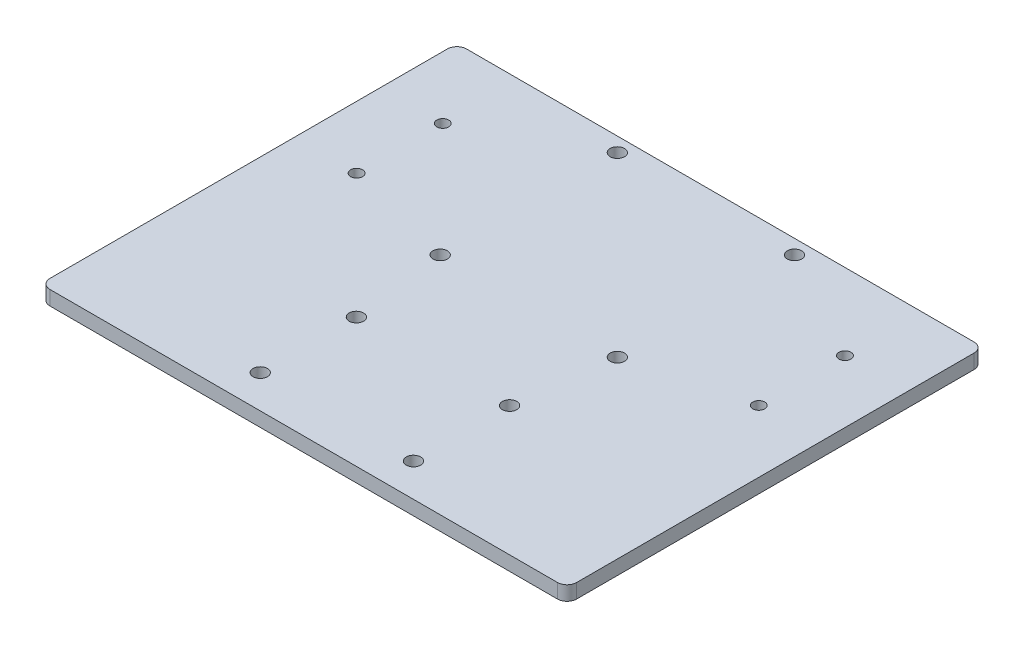
ISO-10303-21;
HEADER;
FILE_DESCRIPTION(('STEP AP214'),'2;1');
FILE_NAME('part.step','',(''),(''),'','','');
FILE_SCHEMA(('AUTOMOTIVE_DESIGN { 1 0 10303 214 1 1 1 1 }'));
ENDSEC;
DATA;
#1=APPLICATION_CONTEXT('core data for automotive mechanical design processes');
#2=APPLICATION_PROTOCOL_DEFINITION('international standard','automotive_design',2000,#1);
#3=PRODUCT_CONTEXT('',#1,'mechanical');
#4=PRODUCT('Part','Part','',(#3));
#5=PRODUCT_RELATED_PRODUCT_CATEGORY('part','',(#4));
#6=PRODUCT_DEFINITION_FORMATION('','',#4);
#7=PRODUCT_DEFINITION_CONTEXT('part definition',#1,'design');
#8=PRODUCT_DEFINITION('design','',#6,#7);
#9=PRODUCT_DEFINITION_SHAPE('','',#8);
#10=(LENGTH_UNIT() NAMED_UNIT(*) SI_UNIT(.MILLI.,.METRE.));
#11=(NAMED_UNIT(*) PLANE_ANGLE_UNIT() SI_UNIT($,.RADIAN.));
#12=(NAMED_UNIT(*) SI_UNIT($,.STERADIAN.) SOLID_ANGLE_UNIT());
#13=UNCERTAINTY_MEASURE_WITH_UNIT(LENGTH_MEASURE(1.E-05),#10,'distance_accuracy_value','');
#14=(GEOMETRIC_REPRESENTATION_CONTEXT(3) GLOBAL_UNCERTAINTY_ASSIGNED_CONTEXT((#13)) GLOBAL_UNIT_ASSIGNED_CONTEXT((#10,
#11,#12)) REPRESENTATION_CONTEXT('',''));
#15=CARTESIAN_POINT('',(0.,0.,0.));
#16=DIRECTION('',(0.,0.,1.));
#17=DIRECTION('',(1.,0.,0.));
#18=AXIS2_PLACEMENT_3D('',#15,#16,#17);
#19=CARTESIAN_POINT('',(55.,3.,43.5));
#20=DIRECTION('',(-1.,0.,0.));
#21=DIRECTION('',(0.,0.,1.));
#22=AXIS2_PLACEMENT_3D('',#19,#20,#21);
#23=PLANE('',#22);
#24=DIRECTION('',(0.,0.,-1.));
#25=VECTOR('',#24,1.);
#26=CARTESIAN_POINT('',(55.,0.,43.5));
#27=LINE('',#26,#25);
#28=CARTESIAN_POINT('',(55.,0.,41.5));
#29=VERTEX_POINT('',#28);
#30=CARTESIAN_POINT('',(55.,0.,-41.5));
#31=VERTEX_POINT('',#30);
#32=EDGE_CURVE('E131',#29,#31,#27,.T.);
#33=ORIENTED_EDGE('',*,*,#32,.T.);
#34=DIRECTION('',(0.,-1.,0.));
#35=VECTOR('',#34,1.);
#36=CARTESIAN_POINT('',(55.,3.,-41.5));
#37=LINE('',#36,#35);
#38=CARTESIAN_POINT('',(55.,3.,-41.5));
#39=VERTEX_POINT('',#38);
#40=EDGE_CURVE('E154',#31,#39,#37,.F.);
#41=ORIENTED_EDGE('',*,*,#40,.T.);
#42=DIRECTION('',(0.,0.,-1.));
#43=VECTOR('',#42,1.);
#44=CARTESIAN_POINT('',(55.,3.,43.5));
#45=LINE('',#44,#43);
#46=CARTESIAN_POINT('',(55.,3.,41.5));
#47=VERTEX_POINT('',#46);
#48=EDGE_CURVE('E129',#47,#39,#45,.T.);
#49=ORIENTED_EDGE('',*,*,#48,.F.);
#50=DIRECTION('',(0.,-1.,0.));
#51=VECTOR('',#50,1.);
#52=CARTESIAN_POINT('',(55.,3.,41.5));
#53=LINE('',#52,#51);
#54=EDGE_CURVE('E151',#47,#29,#53,.T.);
#55=ORIENTED_EDGE('',*,*,#54,.T.);
#56=EDGE_LOOP('',(#33,#41,#49,#55));
#57=FACE_BOUND('',#56,.T.);
#58=ADVANCED_FACE('F34',(#57),#23,.F.);
#59=CARTESIAN_POINT('',(-55.,3.,-43.5));
#60=DIRECTION('',(0.,0.,1.));
#61=DIRECTION('',(1.,0.,0.));
#62=AXIS2_PLACEMENT_3D('',#59,#60,#61);
#63=PLANE('',#62);
#64=DIRECTION('',(-1.,0.,0.));
#65=VECTOR('',#64,1.);
#66=CARTESIAN_POINT('',(-55.,0.,-43.5));
#67=LINE('',#66,#65);
#68=CARTESIAN_POINT('',(53.,0.,-43.5));
#69=VERTEX_POINT('',#68);
#70=CARTESIAN_POINT('',(-53.,0.,-43.5));
#71=VERTEX_POINT('',#70);
#72=EDGE_CURVE('E127',#69,#71,#67,.T.);
#73=ORIENTED_EDGE('',*,*,#72,.T.);
#74=DIRECTION('',(0.,-1.,0.));
#75=VECTOR('',#74,1.);
#76=CARTESIAN_POINT('',(-53.,3.,-43.5));
#77=LINE('',#76,#75);
#78=CARTESIAN_POINT('',(-53.,3.,-43.5));
#79=VERTEX_POINT('',#78);
#80=EDGE_CURVE('E106',#71,#79,#77,.F.);
#81=ORIENTED_EDGE('',*,*,#80,.T.);
#82=DIRECTION('',(-1.,0.,0.));
#83=VECTOR('',#82,1.);
#84=CARTESIAN_POINT('',(-55.,3.,-43.5));
#85=LINE('',#84,#83);
#86=CARTESIAN_POINT('',(53.,3.,-43.5));
#87=VERTEX_POINT('',#86);
#88=EDGE_CURVE('E202',#87,#79,#85,.T.);
#89=ORIENTED_EDGE('',*,*,#88,.F.);
#90=DIRECTION('',(0.,-1.,0.));
#91=VECTOR('',#90,1.);
#92=CARTESIAN_POINT('',(53.,3.,-43.5));
#93=LINE('',#92,#91);
#94=EDGE_CURVE('E111',#87,#69,#93,.T.);
#95=ORIENTED_EDGE('',*,*,#94,.T.);
#96=EDGE_LOOP('',(#73,#81,#89,#95));
#97=FACE_BOUND('',#96,.T.);
#98=ADVANCED_FACE('F260',(#97),#63,.F.);
#99=CARTESIAN_POINT('',(-55.,3.,43.5));
#100=DIRECTION('',(1.,0.,0.));
#101=DIRECTION('',(0.,0.,-1.));
#102=AXIS2_PLACEMENT_3D('',#99,#100,#101);
#103=PLANE('',#102);
#104=DIRECTION('',(0.,0.,1.));
#105=VECTOR('',#104,1.);
#106=CARTESIAN_POINT('',(-55.,3.,43.5));
#107=LINE('',#106,#105);
#108=CARTESIAN_POINT('',(-55.,3.,-41.5));
#109=VERTEX_POINT('',#108);
#110=CARTESIAN_POINT('',(-55.,3.,41.5));
#111=VERTEX_POINT('',#110);
#112=EDGE_CURVE('E120',#109,#111,#107,.T.);
#113=ORIENTED_EDGE('',*,*,#112,.F.);
#114=DIRECTION('',(0.,-1.,0.));
#115=VECTOR('',#114,1.);
#116=CARTESIAN_POINT('',(-55.,3.,-41.5));
#117=LINE('',#116,#115);
#118=CARTESIAN_POINT('',(-55.,0.,-41.5));
#119=VERTEX_POINT('',#118);
#120=EDGE_CURVE('E105',#109,#119,#117,.T.);
#121=ORIENTED_EDGE('',*,*,#120,.T.);
#122=DIRECTION('',(0.,0.,1.));
#123=VECTOR('',#122,1.);
#124=CARTESIAN_POINT('',(-55.,0.,43.5));
#125=LINE('',#124,#123);
#126=CARTESIAN_POINT('',(-55.,0.,41.5));
#127=VERTEX_POINT('',#126);
#128=EDGE_CURVE('E118',#119,#127,#125,.T.);
#129=ORIENTED_EDGE('',*,*,#128,.T.);
#130=DIRECTION('',(0.,-1.,0.));
#131=VECTOR('',#130,1.);
#132=CARTESIAN_POINT('',(-55.,3.,41.5));
#133=LINE('',#132,#131);
#134=EDGE_CURVE('E122',#127,#111,#133,.F.);
#135=ORIENTED_EDGE('',*,*,#134,.T.);
#136=EDGE_LOOP('',(#113,#121,#129,#135));
#137=FACE_BOUND('',#136,.T.);
#138=ADVANCED_FACE('F117',(#137),#103,.F.);
#139=CARTESIAN_POINT('',(-55.,3.,43.5));
#140=DIRECTION('',(0.,0.,-1.));
#141=DIRECTION('',(-1.,0.,0.));
#142=AXIS2_PLACEMENT_3D('',#139,#140,#141);
#143=PLANE('',#142);
#144=DIRECTION('',(1.,0.,0.));
#145=VECTOR('',#144,1.);
#146=CARTESIAN_POINT('',(-55.,0.,43.5));
#147=LINE('',#146,#145);
#148=CARTESIAN_POINT('',(-53.,0.,43.5));
#149=VERTEX_POINT('',#148);
#150=CARTESIAN_POINT('',(53.,0.,43.5));
#151=VERTEX_POINT('',#150);
#152=EDGE_CURVE('E126',#149,#151,#147,.T.);
#153=ORIENTED_EDGE('',*,*,#152,.T.);
#154=DIRECTION('',(0.,-1.,0.));
#155=VECTOR('',#154,1.);
#156=CARTESIAN_POINT('',(53.,3.,43.5));
#157=LINE('',#156,#155);
#158=CARTESIAN_POINT('',(53.,3.,43.5));
#159=VERTEX_POINT('',#158);
#160=EDGE_CURVE('E11',#151,#159,#157,.F.);
#161=ORIENTED_EDGE('',*,*,#160,.T.);
#162=DIRECTION('',(1.,0.,0.));
#163=VECTOR('',#162,1.);
#164=CARTESIAN_POINT('',(-55.,3.,43.5));
#165=LINE('',#164,#163);
#166=CARTESIAN_POINT('',(-53.,3.,43.5));
#167=VERTEX_POINT('',#166);
#168=EDGE_CURVE('E135',#167,#159,#165,.T.);
#169=ORIENTED_EDGE('',*,*,#168,.F.);
#170=DIRECTION('',(0.,-1.,0.));
#171=VECTOR('',#170,1.);
#172=CARTESIAN_POINT('',(-53.,3.,43.5));
#173=LINE('',#172,#171);
#174=EDGE_CURVE('E43',#167,#149,#173,.T.);
#175=ORIENTED_EDGE('',*,*,#174,.T.);
#176=EDGE_LOOP('',(#153,#161,#169,#175));
#177=FACE_BOUND('',#176,.T.);
#178=ADVANCED_FACE('F248',(#177),#143,.F.);
#179=CARTESIAN_POINT('',(0.,3.,0.));
#180=DIRECTION('',(0.,-1.,0.));
#181=DIRECTION('',(0.,0.,-1.));
#182=AXIS2_PLACEMENT_3D('',#179,#180,#181);
#183=PLANE('',#182);
#184=CARTESIAN_POINT('',(-42.,3.,-9.53999999999998));
#185=DIRECTION('',(0.,1.,0.));
#186=DIRECTION('',(0.,0.,1.));
#187=AXIS2_PLACEMENT_3D('',#184,#185,#186);
#188=CIRCLE('',#187,1.25);
#189=CARTESIAN_POINT('',(-42.,3.,-8.28999999999998));
#190=VERTEX_POINT('',#189);
#191=EDGE_CURVE('E214',#190,#190,#188,.T.);
#192=ORIENTED_EDGE('',*,*,#191,.F.);
#193=EDGE_LOOP('',(#192));
#194=FACE_BOUND('',#193,.T.);
#195=CARTESIAN_POINT('',(42.,3.,-27.54));
#196=DIRECTION('',(0.,1.,0.));
#197=DIRECTION('',(0.,0.,1.));
#198=AXIS2_PLACEMENT_3D('',#195,#196,#197);
#199=CIRCLE('',#198,1.25);
#200=CARTESIAN_POINT('',(42.,3.,-26.29));
#201=VERTEX_POINT('',#200);
#202=EDGE_CURVE('E222',#201,#201,#199,.T.);
#203=ORIENTED_EDGE('',*,*,#202,.F.);
#204=EDGE_LOOP('',(#203));
#205=FACE_BOUND('',#204,.T.);
#206=CARTESIAN_POINT('',(42.,3.,-9.53999999999998));
#207=DIRECTION('',(0.,1.,0.));
#208=DIRECTION('',(0.,0.,1.));
#209=AXIS2_PLACEMENT_3D('',#206,#207,#208);
#210=CIRCLE('',#209,1.25000000000001);
#211=CARTESIAN_POINT('',(42.,3.,-8.28999999999998));
#212=VERTEX_POINT('',#211);
#213=EDGE_CURVE('E225',#212,#212,#210,.T.);
#214=ORIENTED_EDGE('',*,*,#213,.F.);
#215=EDGE_LOOP('',(#214));
#216=FACE_BOUND('',#215,.T.);
#217=CARTESIAN_POINT('',(-16.,3.,36.58));
#218=DIRECTION('',(0.,1.,0.));
#219=DIRECTION('',(0.,0.,1.));
#220=AXIS2_PLACEMENT_3D('',#217,#218,#219);
#221=CIRCLE('',#220,1.5);
#222=CARTESIAN_POINT('',(-16.,3.,38.08));
#223=VERTEX_POINT('',#222);
#224=EDGE_CURVE('E228',#223,#223,#221,.T.);
#225=ORIENTED_EDGE('',*,*,#224,.F.);
#226=EDGE_LOOP('',(#225));
#227=FACE_BOUND('',#226,.T.);
#228=CARTESIAN_POINT('',(-42.,3.,-27.54));
#229=DIRECTION('',(0.,1.,0.));
#230=DIRECTION('',(0.,0.,1.));
#231=AXIS2_PLACEMENT_3D('',#228,#229,#230);
#232=CIRCLE('',#231,1.25);
#233=CARTESIAN_POINT('',(-42.,3.,-26.29));
#234=VERTEX_POINT('',#233);
#235=EDGE_CURVE('E210',#234,#234,#232,.T.);
#236=ORIENTED_EDGE('',*,*,#235,.F.);
#237=EDGE_LOOP('',(#236));
#238=FACE_BOUND('',#237,.T.);
#239=CARTESIAN_POINT('',(-18.5,3.,-3.49999999999998));
#240=DIRECTION('',(0.,1.,0.));
#241=DIRECTION('',(0.,0.,1.));
#242=AXIS2_PLACEMENT_3D('',#239,#240,#241);
#243=CIRCLE('',#242,1.5);
#244=CARTESIAN_POINT('',(-18.5,3.,-1.99999999999998));
#245=VERTEX_POINT('',#244);
#246=EDGE_CURVE('E213',#245,#245,#243,.T.);
#247=ORIENTED_EDGE('',*,*,#246,.F.);
#248=EDGE_LOOP('',(#247));
#249=FACE_BOUND('',#248,.T.);
#250=CARTESIAN_POINT('',(18.5,3.,-3.49999999999998));
#251=DIRECTION('',(0.,1.,0.));
#252=DIRECTION('',(0.,0.,1.));
#253=AXIS2_PLACEMENT_3D('',#250,#251,#252);
#254=CIRCLE('',#253,1.5);
#255=CARTESIAN_POINT('',(18.5,3.,-1.99999999999998));
#256=VERTEX_POINT('',#255);
#257=EDGE_CURVE('E217',#256,#256,#254,.T.);
#258=ORIENTED_EDGE('',*,*,#257,.F.);
#259=EDGE_LOOP('',(#258));
#260=FACE_BOUND('',#259,.T.);
#261=CARTESIAN_POINT('',(18.5,3.,-40.5));
#262=DIRECTION('',(0.,1.,0.));
#263=DIRECTION('',(0.,0.,1.));
#264=AXIS2_PLACEMENT_3D('',#261,#262,#263);
#265=CIRCLE('',#264,1.5);
#266=CARTESIAN_POINT('',(18.5,3.,-39.));
#267=VERTEX_POINT('',#266);
#268=EDGE_CURVE('E209',#267,#267,#265,.T.);
#269=ORIENTED_EDGE('',*,*,#268,.F.);
#270=EDGE_LOOP('',(#269));
#271=FACE_BOUND('',#270,.T.);
#272=CARTESIAN_POINT('',(-16.,3.,16.5));
#273=DIRECTION('',(0.,1.,0.));
#274=DIRECTION('',(0.,0.,1.));
#275=AXIS2_PLACEMENT_3D('',#272,#273,#274);
#276=CIRCLE('',#275,1.5);
#277=CARTESIAN_POINT('',(-16.,3.,18.));
#278=VERTEX_POINT('',#277);
#279=EDGE_CURVE('E231',#278,#278,#276,.T.);
#280=ORIENTED_EDGE('',*,*,#279,.F.);
#281=EDGE_LOOP('',(#280));
#282=FACE_BOUND('',#281,.T.);
#283=CARTESIAN_POINT('',(16.,3.,16.5));
#284=DIRECTION('',(0.,1.,0.));
#285=DIRECTION('',(0.,0.,1.));
#286=AXIS2_PLACEMENT_3D('',#283,#284,#285);
#287=CIRCLE('',#286,1.5);
#288=CARTESIAN_POINT('',(16.,3.,18.));
#289=VERTEX_POINT('',#288);
#290=EDGE_CURVE('E237',#289,#289,#287,.T.);
#291=ORIENTED_EDGE('',*,*,#290,.F.);
#292=EDGE_LOOP('',(#291));
#293=FACE_BOUND('',#292,.T.);
#294=CARTESIAN_POINT('',(16.,3.,36.58));
#295=DIRECTION('',(0.,1.,0.));
#296=DIRECTION('',(0.,0.,1.));
#297=AXIS2_PLACEMENT_3D('',#294,#295,#296);
#298=CIRCLE('',#297,1.5);
#299=CARTESIAN_POINT('',(16.,3.,38.08));
#300=VERTEX_POINT('',#299);
#301=EDGE_CURVE('E234',#300,#300,#298,.T.);
#302=ORIENTED_EDGE('',*,*,#301,.F.);
#303=EDGE_LOOP('',(#302));
#304=FACE_BOUND('',#303,.T.);
#305=CARTESIAN_POINT('',(-18.5,3.,-40.5));
#306=DIRECTION('',(0.,1.,0.));
#307=DIRECTION('',(0.,0.,1.));
#308=AXIS2_PLACEMENT_3D('',#305,#306,#307);
#309=CIRCLE('',#308,1.5);
#310=CARTESIAN_POINT('',(-18.5,3.,-39.));
#311=VERTEX_POINT('',#310);
#312=EDGE_CURVE('E162',#311,#311,#309,.T.);
#313=ORIENTED_EDGE('',*,*,#312,.F.);
#314=EDGE_LOOP('',(#313));
#315=FACE_BOUND('',#314,.T.);
#316=ORIENTED_EDGE('',*,*,#88,.T.);
#317=CARTESIAN_POINT('',(-53.,3.,-41.5));
#318=DIRECTION('',(0.,-1.,0.));
#319=DIRECTION('',(0.,0.,-1.));
#320=AXIS2_PLACEMENT_3D('',#317,#318,#319);
#321=CIRCLE('',#320,2.);
#322=EDGE_CURVE('E149',#79,#109,#321,.F.);
#323=ORIENTED_EDGE('',*,*,#322,.T.);
#324=ORIENTED_EDGE('',*,*,#112,.T.);
#325=CARTESIAN_POINT('',(-53.,3.,41.5));
#326=DIRECTION('',(0.,-1.,0.));
#327=DIRECTION('',(0.,0.,-1.));
#328=AXIS2_PLACEMENT_3D('',#325,#326,#327);
#329=CIRCLE('',#328,2.);
#330=EDGE_CURVE('E56',#111,#167,#329,.F.);
#331=ORIENTED_EDGE('',*,*,#330,.T.);
#332=ORIENTED_EDGE('',*,*,#168,.T.);
#333=CARTESIAN_POINT('',(53.,3.,41.5));
#334=DIRECTION('',(0.,-1.,0.));
#335=DIRECTION('',(0.,0.,-1.));
#336=AXIS2_PLACEMENT_3D('',#333,#334,#335);
#337=CIRCLE('',#336,2.);
#338=EDGE_CURVE('E145',#159,#47,#337,.F.);
#339=ORIENTED_EDGE('',*,*,#338,.T.);
#340=ORIENTED_EDGE('',*,*,#48,.T.);
#341=CARTESIAN_POINT('',(53.,3.,-41.5));
#342=DIRECTION('',(0.,-1.,0.));
#343=DIRECTION('',(0.,0.,-1.));
#344=AXIS2_PLACEMENT_3D('',#341,#342,#343);
#345=CIRCLE('',#344,2.);
#346=EDGE_CURVE('E147',#39,#87,#345,.F.);
#347=ORIENTED_EDGE('',*,*,#346,.T.);
#348=EDGE_LOOP('',(#316,#323,#324,#331,#332,#339,#340,#347));
#349=FACE_BOUND('',#348,.T.);
#350=ADVANCED_FACE('F245',(#194,#205,#216,#227,#238,#249,#260,#271,#282,#293,#304,#315,#349),
#183,.F.);
#351=CARTESIAN_POINT('',(0.,0.,0.));
#352=DIRECTION('',(0.,-1.,0.));
#353=DIRECTION('',(0.,0.,-1.));
#354=AXIS2_PLACEMENT_3D('',#351,#352,#353);
#355=PLANE('',#354);
#356=CARTESIAN_POINT('',(-42.,0.,-9.53999999999998));
#357=DIRECTION('',(0.,-1.,0.));
#358=DIRECTION('',(0.,0.,-1.));
#359=AXIS2_PLACEMENT_3D('',#356,#357,#358);
#360=CIRCLE('',#359,1.25);
#361=CARTESIAN_POINT('',(-42.,0.,-10.79));
#362=VERTEX_POINT('',#361);
#363=EDGE_CURVE('E38',#362,#362,#360,.T.);
#364=ORIENTED_EDGE('',*,*,#363,.F.);
#365=EDGE_LOOP('',(#364));
#366=FACE_BOUND('',#365,.T.);
#367=CARTESIAN_POINT('',(42.,0.,-27.54));
#368=DIRECTION('',(0.,-1.,0.));
#369=DIRECTION('',(0.,0.,-1.));
#370=AXIS2_PLACEMENT_3D('',#367,#368,#369);
#371=CIRCLE('',#370,1.25);
#372=CARTESIAN_POINT('',(42.,0.,-28.79));
#373=VERTEX_POINT('',#372);
#374=EDGE_CURVE('E188',#373,#373,#371,.T.);
#375=ORIENTED_EDGE('',*,*,#374,.F.);
#376=EDGE_LOOP('',(#375));
#377=FACE_BOUND('',#376,.T.);
#378=CARTESIAN_POINT('',(42.,0.,-9.53999999999998));
#379=DIRECTION('',(0.,-1.,0.));
#380=DIRECTION('',(0.,0.,-1.));
#381=AXIS2_PLACEMENT_3D('',#378,#379,#380);
#382=CIRCLE('',#381,1.25000000000001);
#383=CARTESIAN_POINT('',(42.,0.,-10.79));
#384=VERTEX_POINT('',#383);
#385=EDGE_CURVE('E186',#384,#384,#382,.T.);
#386=ORIENTED_EDGE('',*,*,#385,.F.);
#387=EDGE_LOOP('',(#386));
#388=FACE_BOUND('',#387,.T.);
#389=CARTESIAN_POINT('',(-16.,0.,36.58));
#390=DIRECTION('',(0.,-1.,0.));
#391=DIRECTION('',(0.,0.,-1.));
#392=AXIS2_PLACEMENT_3D('',#389,#390,#391);
#393=CIRCLE('',#392,1.5);
#394=CARTESIAN_POINT('',(-16.,0.,35.08));
#395=VERTEX_POINT('',#394);
#396=EDGE_CURVE('E183',#395,#395,#393,.T.);
#397=ORIENTED_EDGE('',*,*,#396,.F.);
#398=EDGE_LOOP('',(#397));
#399=FACE_BOUND('',#398,.T.);
#400=CARTESIAN_POINT('',(-42.,0.,-27.54));
#401=DIRECTION('',(0.,-1.,0.));
#402=DIRECTION('',(0.,0.,-1.));
#403=AXIS2_PLACEMENT_3D('',#400,#401,#402);
#404=CIRCLE('',#403,1.25);
#405=CARTESIAN_POINT('',(-42.,0.,-28.79));
#406=VERTEX_POINT('',#405);
#407=EDGE_CURVE('E180',#406,#406,#404,.T.);
#408=ORIENTED_EDGE('',*,*,#407,.F.);
#409=EDGE_LOOP('',(#408));
#410=FACE_BOUND('',#409,.T.);
#411=CARTESIAN_POINT('',(-18.5,0.,-3.49999999999998));
#412=DIRECTION('',(0.,-1.,0.));
#413=DIRECTION('',(0.,0.,-1.));
#414=AXIS2_PLACEMENT_3D('',#411,#412,#413);
#415=CIRCLE('',#414,1.5);
#416=CARTESIAN_POINT('',(-18.5,0.,-4.99999999999998));
#417=VERTEX_POINT('',#416);
#418=EDGE_CURVE('E177',#417,#417,#415,.T.);
#419=ORIENTED_EDGE('',*,*,#418,.F.);
#420=EDGE_LOOP('',(#419));
#421=FACE_BOUND('',#420,.T.);
#422=CARTESIAN_POINT('',(18.5,0.,-3.49999999999998));
#423=DIRECTION('',(0.,-1.,0.));
#424=DIRECTION('',(0.,0.,-1.));
#425=AXIS2_PLACEMENT_3D('',#422,#423,#424);
#426=CIRCLE('',#425,1.5);
#427=CARTESIAN_POINT('',(18.5,0.,-4.99999999999999));
#428=VERTEX_POINT('',#427);
#429=EDGE_CURVE('E174',#428,#428,#426,.T.);
#430=ORIENTED_EDGE('',*,*,#429,.F.);
#431=EDGE_LOOP('',(#430));
#432=FACE_BOUND('',#431,.T.);
#433=CARTESIAN_POINT('',(18.5,0.,-40.5));
#434=DIRECTION('',(0.,-1.,0.));
#435=DIRECTION('',(0.,0.,-1.));
#436=AXIS2_PLACEMENT_3D('',#433,#434,#435);
#437=CIRCLE('',#436,1.5);
#438=CARTESIAN_POINT('',(18.5,0.,-42.));
#439=VERTEX_POINT('',#438);
#440=EDGE_CURVE('E171',#439,#439,#437,.T.);
#441=ORIENTED_EDGE('',*,*,#440,.F.);
#442=EDGE_LOOP('',(#441));
#443=FACE_BOUND('',#442,.T.);
#444=CARTESIAN_POINT('',(-16.,0.,16.5));
#445=DIRECTION('',(0.,-1.,0.));
#446=DIRECTION('',(0.,0.,-1.));
#447=AXIS2_PLACEMENT_3D('',#444,#445,#446);
#448=CIRCLE('',#447,1.5);
#449=CARTESIAN_POINT('',(-16.,0.,15.));
#450=VERTEX_POINT('',#449);
#451=EDGE_CURVE('E168',#450,#450,#448,.T.);
#452=ORIENTED_EDGE('',*,*,#451,.F.);
#453=EDGE_LOOP('',(#452));
#454=FACE_BOUND('',#453,.T.);
#455=CARTESIAN_POINT('',(16.,0.,16.5));
#456=DIRECTION('',(0.,-1.,0.));
#457=DIRECTION('',(0.,0.,-1.));
#458=AXIS2_PLACEMENT_3D('',#455,#456,#457);
#459=CIRCLE('',#458,1.5);
#460=CARTESIAN_POINT('',(16.,0.,15.));
#461=VERTEX_POINT('',#460);
#462=EDGE_CURVE('E165',#461,#461,#459,.T.);
#463=ORIENTED_EDGE('',*,*,#462,.F.);
#464=EDGE_LOOP('',(#463));
#465=FACE_BOUND('',#464,.T.);
#466=CARTESIAN_POINT('',(16.,0.,36.58));
#467=DIRECTION('',(0.,-1.,0.));
#468=DIRECTION('',(0.,0.,-1.));
#469=AXIS2_PLACEMENT_3D('',#466,#467,#468);
#470=CIRCLE('',#469,1.5);
#471=CARTESIAN_POINT('',(16.,0.,35.08));
#472=VERTEX_POINT('',#471);
#473=EDGE_CURVE('E161',#472,#472,#470,.T.);
#474=ORIENTED_EDGE('',*,*,#473,.F.);
#475=EDGE_LOOP('',(#474));
#476=FACE_BOUND('',#475,.T.);
#477=CARTESIAN_POINT('',(-18.5,0.,-40.5));
#478=DIRECTION('',(0.,-1.,0.));
#479=DIRECTION('',(0.,0.,-1.));
#480=AXIS2_PLACEMENT_3D('',#477,#478,#479);
#481=CIRCLE('',#480,1.5);
#482=CARTESIAN_POINT('',(-18.5,0.,-42.));
#483=VERTEX_POINT('',#482);
#484=EDGE_CURVE('E158',#483,#483,#481,.T.);
#485=ORIENTED_EDGE('',*,*,#484,.F.);
#486=EDGE_LOOP('',(#485));
#487=FACE_BOUND('',#486,.T.);
#488=ORIENTED_EDGE('',*,*,#128,.F.);
#489=CARTESIAN_POINT('',(-53.,0.,-41.5));
#490=DIRECTION('',(0.,-1.,0.));
#491=DIRECTION('',(0.,0.,-1.));
#492=AXIS2_PLACEMENT_3D('',#489,#490,#491);
#493=CIRCLE('',#492,2.);
#494=EDGE_CURVE('E101',#119,#71,#493,.T.);
#495=ORIENTED_EDGE('',*,*,#494,.T.);
#496=ORIENTED_EDGE('',*,*,#72,.F.);
#497=CARTESIAN_POINT('',(53.,0.,-41.5));
#498=DIRECTION('',(0.,-1.,0.));
#499=DIRECTION('',(0.,0.,-1.));
#500=AXIS2_PLACEMENT_3D('',#497,#498,#499);
#501=CIRCLE('',#500,2.);
#502=EDGE_CURVE('E112',#69,#31,#501,.T.);
#503=ORIENTED_EDGE('',*,*,#502,.T.);
#504=ORIENTED_EDGE('',*,*,#32,.F.);
#505=CARTESIAN_POINT('',(53.,0.,41.5));
#506=DIRECTION('',(0.,-1.,0.));
#507=DIRECTION('',(0.,0.,-1.));
#508=AXIS2_PLACEMENT_3D('',#505,#506,#507);
#509=CIRCLE('',#508,2.);
#510=EDGE_CURVE('E138',#29,#151,#509,.T.);
#511=ORIENTED_EDGE('',*,*,#510,.T.);
#512=ORIENTED_EDGE('',*,*,#152,.F.);
#513=CARTESIAN_POINT('',(-53.,0.,41.5));
#514=DIRECTION('',(0.,-1.,0.));
#515=DIRECTION('',(0.,0.,-1.));
#516=AXIS2_PLACEMENT_3D('',#513,#514,#515);
#517=CIRCLE('',#516,2.);
#518=EDGE_CURVE('E121',#149,#127,#517,.T.);
#519=ORIENTED_EDGE('',*,*,#518,.T.);
#520=EDGE_LOOP('',(#488,#495,#496,#503,#504,#511,#512,#519));
#521=FACE_BOUND('',#520,.T.);
#522=ADVANCED_FACE('F124',(#366,#377,#388,#399,#410,#421,#432,#443,#454,#465,#476,#487,#521),
#355,.T.);
#523=CARTESIAN_POINT('',(-53.,3.,-41.5));
#524=DIRECTION('',(0.,-1.,0.));
#525=DIRECTION('',(0.,0.,-1.));
#526=AXIS2_PLACEMENT_3D('',#523,#524,#525);
#527=CYLINDRICAL_SURFACE('',#526,2.);
#528=ORIENTED_EDGE('',*,*,#322,.F.);
#529=ORIENTED_EDGE('',*,*,#80,.F.);
#530=ORIENTED_EDGE('',*,*,#494,.F.);
#531=ORIENTED_EDGE('',*,*,#120,.F.);
#532=EDGE_LOOP('',(#528,#529,#530,#531));
#533=FACE_BOUND('',#532,.T.);
#534=ADVANCED_FACE('F104',(#533),#527,.T.);
#535=CARTESIAN_POINT('',(53.,3.,-41.5));
#536=DIRECTION('',(0.,-1.,0.));
#537=DIRECTION('',(0.,0.,-1.));
#538=AXIS2_PLACEMENT_3D('',#535,#536,#537);
#539=CYLINDRICAL_SURFACE('',#538,2.);
#540=ORIENTED_EDGE('',*,*,#346,.F.);
#541=ORIENTED_EDGE('',*,*,#40,.F.);
#542=ORIENTED_EDGE('',*,*,#502,.F.);
#543=ORIENTED_EDGE('',*,*,#94,.F.);
#544=EDGE_LOOP('',(#540,#541,#542,#543));
#545=FACE_BOUND('',#544,.T.);
#546=ADVANCED_FACE('F262',(#545),#539,.T.);
#547=CARTESIAN_POINT('',(53.,3.,41.5));
#548=DIRECTION('',(0.,-1.,0.));
#549=DIRECTION('',(0.,0.,-1.));
#550=AXIS2_PLACEMENT_3D('',#547,#548,#549);
#551=CYLINDRICAL_SURFACE('',#550,2.);
#552=ORIENTED_EDGE('',*,*,#338,.F.);
#553=ORIENTED_EDGE('',*,*,#160,.F.);
#554=ORIENTED_EDGE('',*,*,#510,.F.);
#555=ORIENTED_EDGE('',*,*,#54,.F.);
#556=EDGE_LOOP('',(#552,#553,#554,#555));
#557=FACE_BOUND('',#556,.T.);
#558=ADVANCED_FACE('F267',(#557),#551,.T.);
#559=CARTESIAN_POINT('',(-53.,3.,41.5));
#560=DIRECTION('',(0.,-1.,0.));
#561=DIRECTION('',(0.,0.,-1.));
#562=AXIS2_PLACEMENT_3D('',#559,#560,#561);
#563=CYLINDRICAL_SURFACE('',#562,2.);
#564=ORIENTED_EDGE('',*,*,#330,.F.);
#565=ORIENTED_EDGE('',*,*,#134,.F.);
#566=ORIENTED_EDGE('',*,*,#518,.F.);
#567=ORIENTED_EDGE('',*,*,#174,.F.);
#568=EDGE_LOOP('',(#564,#565,#566,#567));
#569=FACE_BOUND('',#568,.T.);
#570=ADVANCED_FACE('F36',(#569),#563,.T.);
#571=CARTESIAN_POINT('',(-18.5,-7.,-40.5));
#572=DIRECTION('',(0.,1.,0.));
#573=DIRECTION('',(0.,0.,1.));
#574=AXIS2_PLACEMENT_3D('',#571,#572,#573);
#575=CYLINDRICAL_SURFACE('',#574,1.5);
#576=ORIENTED_EDGE('',*,*,#484,.T.);
#577=EDGE_LOOP('',(#576));
#578=FACE_BOUND('',#577,.T.);
#579=ORIENTED_EDGE('',*,*,#312,.T.);
#580=EDGE_LOOP('',(#579));
#581=FACE_BOUND('',#580,.T.);
#582=ADVANCED_FACE('F284',(#578,#581),#575,.F.);
#583=CARTESIAN_POINT('',(16.,-7.,36.58));
#584=DIRECTION('',(0.,1.,0.));
#585=DIRECTION('',(0.,0.,1.));
#586=AXIS2_PLACEMENT_3D('',#583,#584,#585);
#587=CYLINDRICAL_SURFACE('',#586,1.5);
#588=ORIENTED_EDGE('',*,*,#473,.T.);
#589=EDGE_LOOP('',(#588));
#590=FACE_BOUND('',#589,.T.);
#591=ORIENTED_EDGE('',*,*,#301,.T.);
#592=EDGE_LOOP('',(#591));
#593=FACE_BOUND('',#592,.T.);
#594=ADVANCED_FACE('F289',(#590,#593),#587,.F.);
#595=CARTESIAN_POINT('',(16.,-7.,16.5));
#596=DIRECTION('',(0.,1.,0.));
#597=DIRECTION('',(0.,0.,1.));
#598=AXIS2_PLACEMENT_3D('',#595,#596,#597);
#599=CYLINDRICAL_SURFACE('',#598,1.5);
#600=ORIENTED_EDGE('',*,*,#462,.T.);
#601=EDGE_LOOP('',(#600));
#602=FACE_BOUND('',#601,.T.);
#603=ORIENTED_EDGE('',*,*,#290,.T.);
#604=EDGE_LOOP('',(#603));
#605=FACE_BOUND('',#604,.T.);
#606=ADVANCED_FACE('F295',(#602,#605),#599,.F.);
#607=CARTESIAN_POINT('',(-16.,-7.,16.5));
#608=DIRECTION('',(0.,1.,0.));
#609=DIRECTION('',(0.,0.,1.));
#610=AXIS2_PLACEMENT_3D('',#607,#608,#609);
#611=CYLINDRICAL_SURFACE('',#610,1.5);
#612=ORIENTED_EDGE('',*,*,#451,.T.);
#613=EDGE_LOOP('',(#612));
#614=FACE_BOUND('',#613,.T.);
#615=ORIENTED_EDGE('',*,*,#279,.T.);
#616=EDGE_LOOP('',(#615));
#617=FACE_BOUND('',#616,.T.);
#618=ADVANCED_FACE('F243',(#614,#617),#611,.F.);
#619=CARTESIAN_POINT('',(18.5,-7.,-40.5));
#620=DIRECTION('',(0.,1.,0.));
#621=DIRECTION('',(0.,0.,1.));
#622=AXIS2_PLACEMENT_3D('',#619,#620,#621);
#623=CYLINDRICAL_SURFACE('',#622,1.5);
#624=ORIENTED_EDGE('',*,*,#440,.T.);
#625=EDGE_LOOP('',(#624));
#626=FACE_BOUND('',#625,.T.);
#627=ORIENTED_EDGE('',*,*,#268,.T.);
#628=EDGE_LOOP('',(#627));
#629=FACE_BOUND('',#628,.T.);
#630=ADVANCED_FACE('F367',(#626,#629),#623,.F.);
#631=CARTESIAN_POINT('',(18.5,-7.,-3.49999999999998));
#632=DIRECTION('',(0.,1.,0.));
#633=DIRECTION('',(0.,0.,1.));
#634=AXIS2_PLACEMENT_3D('',#631,#632,#633);
#635=CYLINDRICAL_SURFACE('',#634,1.5);
#636=ORIENTED_EDGE('',*,*,#429,.T.);
#637=EDGE_LOOP('',(#636));
#638=FACE_BOUND('',#637,.T.);
#639=ORIENTED_EDGE('',*,*,#257,.T.);
#640=EDGE_LOOP('',(#639));
#641=FACE_BOUND('',#640,.T.);
#642=ADVANCED_FACE('F376',(#638,#641),#635,.F.);
#643=CARTESIAN_POINT('',(-18.5,-7.,-3.49999999999998));
#644=DIRECTION('',(0.,1.,0.));
#645=DIRECTION('',(0.,0.,1.));
#646=AXIS2_PLACEMENT_3D('',#643,#644,#645);
#647=CYLINDRICAL_SURFACE('',#646,1.5);
#648=ORIENTED_EDGE('',*,*,#418,.T.);
#649=EDGE_LOOP('',(#648));
#650=FACE_BOUND('',#649,.T.);
#651=ORIENTED_EDGE('',*,*,#246,.T.);
#652=EDGE_LOOP('',(#651));
#653=FACE_BOUND('',#652,.T.);
#654=ADVANCED_FACE('F385',(#650,#653),#647,.F.);
#655=CARTESIAN_POINT('',(-42.,-7.,-27.54));
#656=DIRECTION('',(0.,1.,0.));
#657=DIRECTION('',(0.,0.,1.));
#658=AXIS2_PLACEMENT_3D('',#655,#656,#657);
#659=CYLINDRICAL_SURFACE('',#658,1.25);
#660=ORIENTED_EDGE('',*,*,#407,.T.);
#661=EDGE_LOOP('',(#660));
#662=FACE_BOUND('',#661,.T.);
#663=ORIENTED_EDGE('',*,*,#235,.T.);
#664=EDGE_LOOP('',(#663));
#665=FACE_BOUND('',#664,.T.);
#666=ADVANCED_FACE('F300',(#662,#665),#659,.F.);
#667=CARTESIAN_POINT('',(-16.,-7.,36.58));
#668=DIRECTION('',(0.,1.,0.));
#669=DIRECTION('',(0.,0.,1.));
#670=AXIS2_PLACEMENT_3D('',#667,#668,#669);
#671=CYLINDRICAL_SURFACE('',#670,1.5);
#672=ORIENTED_EDGE('',*,*,#396,.T.);
#673=EDGE_LOOP('',(#672));
#674=FACE_BOUND('',#673,.T.);
#675=ORIENTED_EDGE('',*,*,#224,.T.);
#676=EDGE_LOOP('',(#675));
#677=FACE_BOUND('',#676,.T.);
#678=ADVANCED_FACE('F401',(#674,#677),#671,.F.);
#679=CARTESIAN_POINT('',(42.,-7.,-9.53999999999998));
#680=DIRECTION('',(0.,1.,0.));
#681=DIRECTION('',(0.,0.,1.));
#682=AXIS2_PLACEMENT_3D('',#679,#680,#681);
#683=CYLINDRICAL_SURFACE('',#682,1.25000000000001);
#684=ORIENTED_EDGE('',*,*,#385,.T.);
#685=EDGE_LOOP('',(#684));
#686=FACE_BOUND('',#685,.T.);
#687=ORIENTED_EDGE('',*,*,#213,.T.);
#688=EDGE_LOOP('',(#687));
#689=FACE_BOUND('',#688,.T.);
#690=ADVANCED_FACE('F409',(#686,#689),#683,.F.);
#691=CARTESIAN_POINT('',(42.,-7.,-27.54));
#692=DIRECTION('',(0.,1.,0.));
#693=DIRECTION('',(0.,0.,1.));
#694=AXIS2_PLACEMENT_3D('',#691,#692,#693);
#695=CYLINDRICAL_SURFACE('',#694,1.25);
#696=ORIENTED_EDGE('',*,*,#374,.T.);
#697=EDGE_LOOP('',(#696));
#698=FACE_BOUND('',#697,.T.);
#699=ORIENTED_EDGE('',*,*,#202,.T.);
#700=EDGE_LOOP('',(#699));
#701=FACE_BOUND('',#700,.T.);
#702=ADVANCED_FACE('F418',(#698,#701),#695,.F.);
#703=CARTESIAN_POINT('',(-42.,-7.,-9.53999999999998));
#704=DIRECTION('',(0.,1.,0.));
#705=DIRECTION('',(0.,0.,1.));
#706=AXIS2_PLACEMENT_3D('',#703,#704,#705);
#707=CYLINDRICAL_SURFACE('',#706,1.25);
#708=ORIENTED_EDGE('',*,*,#363,.T.);
#709=EDGE_LOOP('',(#708));
#710=FACE_BOUND('',#709,.T.);
#711=ORIENTED_EDGE('',*,*,#191,.T.);
#712=EDGE_LOOP('',(#711));
#713=FACE_BOUND('',#712,.T.);
#714=ADVANCED_FACE('F427',(#710,#713),#707,.F.);
#715=CLOSED_SHELL('',(#58,#98,#138,#178,#350,#522,#534,#546,#558,#570,#582,#594,#606,#618,#630,
#642,#654,#666,#678,#690,#702,#714));
#716=MANIFOLD_SOLID_BREP('B2',#715);
#717=ADVANCED_BREP_SHAPE_REPRESENTATION('',(#18,#716),#14);
#718=SHAPE_DEFINITION_REPRESENTATION(#9,#717);
ENDSEC;
END-ISO-10303-21;
